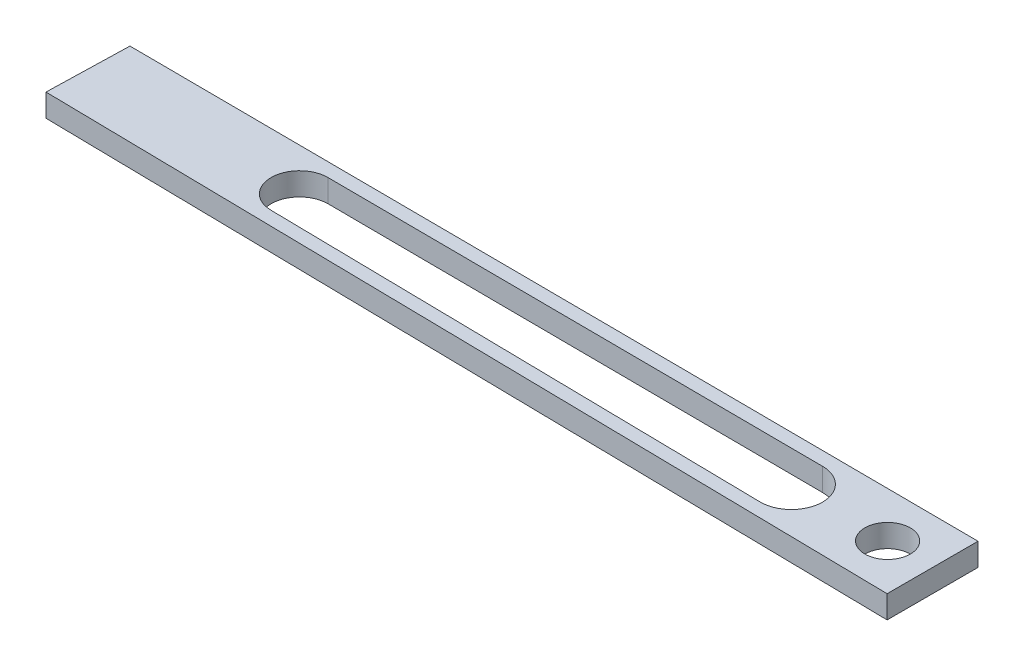
ISO-10303-21;
HEADER;
FILE_DESCRIPTION(('STEP AP214'),'2;1');
FILE_NAME('part.step','',(''),(''),'','','');
FILE_SCHEMA(('AUTOMOTIVE_DESIGN { 1 0 10303 214 1 1 1 1 }'));
ENDSEC;
DATA;
#1=APPLICATION_CONTEXT('core data for automotive mechanical design processes');
#2=APPLICATION_PROTOCOL_DEFINITION('international standard','automotive_design',2000,#1);
#3=PRODUCT_CONTEXT('',#1,'mechanical');
#4=PRODUCT('Part','Part','',(#3));
#5=PRODUCT_RELATED_PRODUCT_CATEGORY('part','',(#4));
#6=PRODUCT_DEFINITION_FORMATION('','',#4);
#7=PRODUCT_DEFINITION_CONTEXT('part definition',#1,'design');
#8=PRODUCT_DEFINITION('design','',#6,#7);
#9=PRODUCT_DEFINITION_SHAPE('','',#8);
#10=(LENGTH_UNIT() NAMED_UNIT(*) SI_UNIT(.MILLI.,.METRE.));
#11=(NAMED_UNIT(*) PLANE_ANGLE_UNIT() SI_UNIT($,.RADIAN.));
#12=(NAMED_UNIT(*) SI_UNIT($,.STERADIAN.) SOLID_ANGLE_UNIT());
#13=UNCERTAINTY_MEASURE_WITH_UNIT(LENGTH_MEASURE(1.E-05),#10,'distance_accuracy_value','');
#14=(GEOMETRIC_REPRESENTATION_CONTEXT(3) GLOBAL_UNCERTAINTY_ASSIGNED_CONTEXT((#13)) GLOBAL_UNIT_ASSIGNED_CONTEXT((#10,
#11,#12)) REPRESENTATION_CONTEXT('',''));
#15=CARTESIAN_POINT('',(0.,0.,0.));
#16=DIRECTION('',(0.,0.,1.));
#17=DIRECTION('',(1.,0.,0.));
#18=AXIS2_PLACEMENT_3D('',#15,#16,#17);
#19=CARTESIAN_POINT('',(0.,0.,0.));
#20=DIRECTION('',(0.,1.,0.));
#21=DIRECTION('',(0.,0.,1.));
#22=AXIS2_PLACEMENT_3D('',#19,#20,#21);
#23=PLANE('',#22);
#24=CARTESIAN_POINT('',(87.6497861096846,0.,53.7974154635264));
#25=DIRECTION('',(0.,1.,0.));
#26=DIRECTION('',(0.,0.,1.));
#27=AXIS2_PLACEMENT_3D('',#24,#25,#26);
#28=CIRCLE('',#27,5.00000000000001);
#29=CARTESIAN_POINT('',(87.6497861096846,0.,58.7974154635264));
#30=VERTEX_POINT('',#29);
#31=EDGE_CURVE('E505',#30,#30,#28,.T.);
#32=ORIENTED_EDGE('',*,*,#31,.T.);
#33=EDGE_LOOP('',(#32));
#34=FACE_BOUND('',#33,.T.);
#35=DIRECTION('',(0.,0.,-1.));
#36=VECTOR('',#35,1.);
#37=CARTESIAN_POINT('',(97.6497861096846,0.,63.9070186237985));
#38=LINE('',#37,#36);
#39=CARTESIAN_POINT('',(97.6497861096846,0.,63.9070186237985));
#40=VERTEX_POINT('',#39);
#41=CARTESIAN_POINT('',(97.6497861096846,0.,43.9070188933852));
#42=VERTEX_POINT('',#41);
#43=EDGE_CURVE('E356',#40,#42,#38,.T.);
#44=ORIENTED_EDGE('',*,*,#43,.F.);
#45=DIRECTION('',(0.999867797982521,0.,0.0162599679454003));
#46=VECTOR('',#45,1.);
#47=CARTESIAN_POINT('',(-90.4748936494814,0.,60.847712914789));
#48=LINE('',#47,#46);
#49=CARTESIAN_POINT('',(-90.4748936494814,0.,60.847712914789));
#50=VERTEX_POINT('',#49);
#51=EDGE_CURVE('E362',#50,#40,#48,.T.);
#52=ORIENTED_EDGE('',*,*,#51,.F.);
#53=DIRECTION('',(-0.0263752128740894,0.,0.999652113560436));
#54=VECTOR('',#53,1.);
#55=CARTESIAN_POINT('',(-89.9999745998487,0.,42.8477129147204));
#56=LINE('',#55,#54);
#57=CARTESIAN_POINT('',(-89.9999745998487,0.,42.8477129147204));
#58=VERTEX_POINT('',#57);
#59=EDGE_CURVE('E378',#58,#50,#56,.T.);
#60=ORIENTED_EDGE('',*,*,#59,.F.);
#61=DIRECTION('',(-0.999984066674016,0.,-0.00564503304662899));
#62=VECTOR('',#61,1.);
#63=CARTESIAN_POINT('',(97.6497861096846,0.,43.9070188933852));
#64=LINE('',#63,#62);
#65=EDGE_CURVE('E375',#42,#58,#64,.T.);
#66=ORIENTED_EDGE('',*,*,#65,.F.);
#67=EDGE_LOOP('',(#44,#52,#60,#66));
#68=FACE_BOUND('',#67,.T.);
#69=CARTESIAN_POINT('',(-87.2369270271719,0.,51.8805994612299));
#70=DIRECTION('',(0.,1.,0.));
#71=DIRECTION('',(0.,0.,1.));
#72=AXIS2_PLACEMENT_3D('',#69,#70,#71);
#73=CIRCLE('',#72,1.5);
#74=CARTESIAN_POINT('',(-87.4316047681078,0.,50.3932862537366));
#75=VERTEX_POINT('',#74);
#76=CARTESIAN_POINT('',(-87.4316047681078,0.,53.3679126687232));
#77=VERTEX_POINT('',#76);
#78=EDGE_CURVE('E191',#75,#77,#73,.T.);
#79=ORIENTED_EDGE('',*,*,#78,.T.);
#80=DIRECTION('',(0.991542138328882,0.,0.129785160623963));
#81=VECTOR('',#80,1.);
#82=CARTESIAN_POINT('',(-87.4316047681078,0.,53.3679126687232));
#83=LINE('',#82,#81);
#84=CARTESIAN_POINT('',(-72.4369270271719,0.,55.3305994612299));
#85=VERTEX_POINT('',#84);
#86=EDGE_CURVE('E276',#77,#85,#83,.T.);
#87=ORIENTED_EDGE('',*,*,#86,.T.);
#88=DIRECTION('',(0.,0.,1.));
#89=VECTOR('',#88,1.);
#90=CARTESIAN_POINT('',(-72.4369270271719,0.,55.3305994612299));
#91=LINE('',#90,#89);
#92=CARTESIAN_POINT('',(-72.4369270271719,0.,58.6305994612299));
#93=VERTEX_POINT('',#92);
#94=EDGE_CURVE('E280',#85,#93,#91,.T.);
#95=ORIENTED_EDGE('',*,*,#94,.T.);
#96=CARTESIAN_POINT('',(-70.5369270271719,0.,58.6305994612299));
#97=DIRECTION('',(0.,1.,0.));
#98=DIRECTION('',(0.,0.,1.));
#99=AXIS2_PLACEMENT_3D('',#96,#97,#98);
#100=CIRCLE('',#99,1.9);
#101=CARTESIAN_POINT('',(-68.6369270271719,0.,58.6305994612299));
#102=VERTEX_POINT('',#101);
#103=EDGE_CURVE('E284',#93,#102,#100,.T.);
#104=ORIENTED_EDGE('',*,*,#103,.T.);
#105=DIRECTION('',(0.,0.,-1.));
#106=VECTOR('',#105,1.);
#107=CARTESIAN_POINT('',(-68.6369270271719,0.,58.6305994612299));
#108=LINE('',#107,#106);
#109=CARTESIAN_POINT('',(-68.6369270271719,0.,54.7805994612299));
#110=VERTEX_POINT('',#109);
#111=EDGE_CURVE('E288',#102,#110,#108,.T.);
#112=ORIENTED_EDGE('',*,*,#111,.T.);
#113=DIRECTION('',(-0.998450950906806,0.,0.0556390028064357));
#114=VECTOR('',#113,1.);
#115=CARTESIAN_POINT('',(-55.641618402645,0.,54.0564316767495));
#116=LINE('',#115,#114);
#117=CARTESIAN_POINT('',(-55.641618402645,0.,54.0564316767495));
#118=VERTEX_POINT('',#117);
#119=EDGE_CURVE('E292',#118,#110,#116,.T.);
#120=ORIENTED_EDGE('',*,*,#119,.F.);
#121=CARTESIAN_POINT('',(-55.8406986191341,0.,52.2247124698447));
#122=DIRECTION('',(0.,1.,0.));
#123=DIRECTION('',(0.,0.,1.));
#124=AXIS2_PLACEMENT_3D('',#121,#122,#123);
#125=CIRCLE('',#124,1.84250595264738);
#126=CARTESIAN_POINT('',(-55.6416184026456,0.,50.3929932629399));
#127=VERTEX_POINT('',#126);
#128=EDGE_CURVE('E296',#118,#127,#125,.T.);
#129=ORIENTED_EDGE('',*,*,#128,.T.);
#130=DIRECTION('',(-0.994145611455372,0.,-0.108048615095357));
#131=VECTOR('',#130,1.);
#132=CARTESIAN_POINT('',(-55.6416184026456,0.,50.3929932629399));
#133=LINE('',#132,#131);
#134=CARTESIAN_POINT('',(-68.6369270271719,0.,48.9805994612299));
#135=VERTEX_POINT('',#134);
#136=EDGE_CURVE('E300',#127,#135,#133,.T.);
#137=ORIENTED_EDGE('',*,*,#136,.T.);
#138=DIRECTION('',(0.,0.,-1.));
#139=VECTOR('',#138,1.);
#140=CARTESIAN_POINT('',(-68.6369270271719,0.,48.9805994612299));
#141=LINE('',#140,#139);
#142=CARTESIAN_POINT('',(-68.6369270271719,0.,45.1305994612299));
#143=VERTEX_POINT('',#142);
#144=EDGE_CURVE('E304',#135,#143,#141,.T.);
#145=ORIENTED_EDGE('',*,*,#144,.T.);
#146=CARTESIAN_POINT('',(-70.5369270271719,0.,45.1305994612299));
#147=DIRECTION('',(0.,1.,0.));
#148=DIRECTION('',(0.,0.,1.));
#149=AXIS2_PLACEMENT_3D('',#146,#147,#148);
#150=CIRCLE('',#149,1.90000000000001);
#151=CARTESIAN_POINT('',(-72.4369270271719,0.,45.1305994612299));
#152=VERTEX_POINT('',#151);
#153=EDGE_CURVE('E308',#143,#152,#150,.T.);
#154=ORIENTED_EDGE('',*,*,#153,.T.);
#155=DIRECTION('',(0.,0.,1.));
#156=VECTOR('',#155,1.);
#157=CARTESIAN_POINT('',(-72.4369270271719,0.,45.1305994612299));
#158=LINE('',#157,#156);
#159=CARTESIAN_POINT('',(-72.4369270271719,0.,48.4305994612299));
#160=VERTEX_POINT('',#159);
#161=EDGE_CURVE('E312',#152,#160,#158,.T.);
#162=ORIENTED_EDGE('',*,*,#161,.T.);
#163=DIRECTION('',(0.991542138328882,0.,-0.129785160623963));
#164=VECTOR('',#163,1.);
#165=CARTESIAN_POINT('',(-87.4316047681078,0.,50.3932862537366));
#166=LINE('',#165,#164);
#167=EDGE_CURVE('E237',#75,#160,#166,.T.);
#168=ORIENTED_EDGE('',*,*,#167,.F.);
#169=EDGE_LOOP('',(#79,#87,#95,#104,#112,#120,#129,#137,#145,#154,#162,#168));
#170=FACE_BOUND('',#169,.T.);
#171=CARTESIAN_POINT('',(66.2645481598678,0.,53.5630262090205));
#172=DIRECTION('',(0.,1.,0.));
#173=DIRECTION('',(0.,0.,1.));
#174=AXIS2_PLACEMENT_3D('',#171,#172,#173);
#175=CIRCLE('',#174,6.83230195508906);
#176=CARTESIAN_POINT('',(66.1534297543832,0.,60.3944245069883));
#177=VERTEX_POINT('',#176);
#178=CARTESIAN_POINT('',(66.303161817034,0.,46.7308333698953));
#179=VERTEX_POINT('',#178);
#180=EDGE_CURVE('E201',#177,#179,#175,.T.);
#181=ORIENTED_EDGE('',*,*,#180,.T.);
#182=DIRECTION('',(0.999984029399674,0.,0.00565163211754443));
#183=VECTOR('',#182,1.);
#184=CARTESIAN_POINT('',(-0.261983475145693,0.,46.3546256485899));
#185=LINE('',#184,#183);
#186=CARTESIAN_POINT('',(-43.135065573272,0.,46.1123188910416));
#187=VERTEX_POINT('',#186);
#188=EDGE_CURVE('E60',#187,#179,#185,.T.);
#189=ORIENTED_EDGE('',*,*,#188,.F.);
#190=CARTESIAN_POINT('',(-43.1703547205744,0.,52.3635836139342));
#191=DIRECTION('',(0.,1.,0.));
#192=DIRECTION('',(0.,0.,1.));
#193=AXIS2_PLACEMENT_3D('',#190,#191,#192);
#194=CIRCLE('',#193,6.25136432785665);
#195=CARTESIAN_POINT('',(-43.2720481743179,0.,58.6141207429387));
#196=VERTEX_POINT('',#195);
#197=EDGE_CURVE('E189',#187,#196,#194,.T.);
#198=ORIENTED_EDGE('',*,*,#197,.T.);
#199=DIRECTION('',(-0.999867677068761,0.,-0.0162674015478994));
#200=VECTOR('',#199,1.);
#201=CARTESIAN_POINT('',(-0.96482427950633,0.,59.3024404228902));
#202=LINE('',#201,#200);
#203=EDGE_CURVE('E218',#177,#196,#202,.T.);
#204=ORIENTED_EDGE('',*,*,#203,.F.);
#205=EDGE_LOOP('',(#181,#189,#198,#204));
#206=FACE_BOUND('',#205,.T.);
#207=ADVANCED_FACE('F44',(#34,#68,#170,#206),#23,.F.);
#208=CARTESIAN_POINT('',(0.,5.,0.));
#209=DIRECTION('',(0.,1.,0.));
#210=DIRECTION('',(0.,0.,1.));
#211=AXIS2_PLACEMENT_3D('',#208,#209,#210);
#212=PLANE('',#211);
#213=CARTESIAN_POINT('',(87.6497861096846,5.,53.7974154635264));
#214=DIRECTION('',(0.,1.,0.));
#215=DIRECTION('',(0.,0.,1.));
#216=AXIS2_PLACEMENT_3D('',#213,#214,#215);
#217=CIRCLE('',#216,5.00000000000001);
#218=CARTESIAN_POINT('',(87.6497861096846,5.,58.7974154635264));
#219=VERTEX_POINT('',#218);
#220=EDGE_CURVE('E215',#219,#219,#217,.T.);
#221=ORIENTED_EDGE('',*,*,#220,.F.);
#222=EDGE_LOOP('',(#221));
#223=FACE_BOUND('',#222,.T.);
#224=DIRECTION('',(0.,0.,-1.));
#225=VECTOR('',#224,1.);
#226=CARTESIAN_POINT('',(97.6497861096846,5.,63.9070186237985));
#227=LINE('',#226,#225);
#228=CARTESIAN_POINT('',(97.6497861096846,5.,63.9070186237985));
#229=VERTEX_POINT('',#228);
#230=CARTESIAN_POINT('',(97.6497861096846,5.,43.9070188933852));
#231=VERTEX_POINT('',#230);
#232=EDGE_CURVE('E357',#229,#231,#227,.T.);
#233=ORIENTED_EDGE('',*,*,#232,.T.);
#234=DIRECTION('',(-0.999984066674016,0.,-0.00564503304662899));
#235=VECTOR('',#234,1.);
#236=CARTESIAN_POINT('',(97.6497861096846,5.,43.9070188933852));
#237=LINE('',#236,#235);
#238=CARTESIAN_POINT('',(-89.9999745998487,5.,42.8477129147204));
#239=VERTEX_POINT('',#238);
#240=EDGE_CURVE('E361',#231,#239,#237,.T.);
#241=ORIENTED_EDGE('',*,*,#240,.T.);
#242=DIRECTION('',(-0.0263752128740894,0.,0.999652113560436));
#243=VECTOR('',#242,1.);
#244=CARTESIAN_POINT('',(-89.9999745998487,5.,42.8477129147204));
#245=LINE('',#244,#243);
#246=CARTESIAN_POINT('',(-90.4748936494814,5.,60.847712914789));
#247=VERTEX_POINT('',#246);
#248=EDGE_CURVE('E365',#239,#247,#245,.T.);
#249=ORIENTED_EDGE('',*,*,#248,.T.);
#250=DIRECTION('',(0.999867797982521,0.,0.0162599679454003));
#251=VECTOR('',#250,1.);
#252=CARTESIAN_POINT('',(-90.4748936494814,5.,60.847712914789));
#253=LINE('',#252,#251);
#254=EDGE_CURVE('E368',#247,#229,#253,.T.);
#255=ORIENTED_EDGE('',*,*,#254,.T.);
#256=EDGE_LOOP('',(#233,#241,#249,#255));
#257=FACE_BOUND('',#256,.T.);
#258=DIRECTION('',(0.999984029399674,0.,0.00565163211754443));
#259=VECTOR('',#258,1.);
#260=CARTESIAN_POINT('',(-0.261983475145693,5.,46.3546256485899));
#261=LINE('',#260,#259);
#262=CARTESIAN_POINT('',(-43.135065573272,5.,46.1123188910416));
#263=VERTEX_POINT('',#262);
#264=CARTESIAN_POINT('',(66.303161817034,5.,46.7308333698953));
#265=VERTEX_POINT('',#264);
#266=EDGE_CURVE('E195',#263,#265,#261,.T.);
#267=ORIENTED_EDGE('',*,*,#266,.T.);
#268=CARTESIAN_POINT('',(66.2645481598678,5.,53.5630262090205));
#269=DIRECTION('',(0.,1.,0.));
#270=DIRECTION('',(0.,0.,1.));
#271=AXIS2_PLACEMENT_3D('',#268,#269,#270);
#272=CIRCLE('',#271,6.83230195508906);
#273=CARTESIAN_POINT('',(66.1534297543832,5.,60.3944245069883));
#274=VERTEX_POINT('',#273);
#275=EDGE_CURVE('E207',#274,#265,#272,.T.);
#276=ORIENTED_EDGE('',*,*,#275,.F.);
#277=DIRECTION('',(-0.999867677068761,0.,-0.0162674015478994));
#278=VECTOR('',#277,1.);
#279=CARTESIAN_POINT('',(-0.96482427950633,5.,59.3024404228902));
#280=LINE('',#279,#278);
#281=CARTESIAN_POINT('',(-43.2720481743179,5.,58.6141207429387));
#282=VERTEX_POINT('',#281);
#283=EDGE_CURVE('E68',#274,#282,#280,.T.);
#284=ORIENTED_EDGE('',*,*,#283,.T.);
#285=CARTESIAN_POINT('',(-43.1703547205744,5.,52.3635836139342));
#286=DIRECTION('',(0.,1.,0.));
#287=DIRECTION('',(0.,0.,1.));
#288=AXIS2_PLACEMENT_3D('',#285,#286,#287);
#289=CIRCLE('',#288,6.25136432785665);
#290=EDGE_CURVE('E187',#263,#282,#289,.T.);
#291=ORIENTED_EDGE('',*,*,#290,.F.);
#292=EDGE_LOOP('',(#267,#276,#284,#291));
#293=FACE_BOUND('',#292,.T.);
#294=ADVANCED_FACE('F203',(#223,#257,#293),#212,.T.);
#295=CARTESIAN_POINT('',(97.6497861096846,5.,63.9070186237985));
#296=DIRECTION('',(-1.,0.,0.));
#297=DIRECTION('',(0.,0.,1.));
#298=AXIS2_PLACEMENT_3D('',#295,#296,#297);
#299=PLANE('',#298);
#300=ORIENTED_EDGE('',*,*,#43,.T.);
#301=DIRECTION('',(0.,-1.,0.));
#302=VECTOR('',#301,1.);
#303=CARTESIAN_POINT('',(97.6497861096846,5.,43.9070188933852));
#304=LINE('',#303,#302);
#305=EDGE_CURVE('E12',#231,#42,#304,.T.);
#306=ORIENTED_EDGE('',*,*,#305,.F.);
#307=ORIENTED_EDGE('',*,*,#232,.F.);
#308=DIRECTION('',(0.,-1.,0.));
#309=VECTOR('',#308,1.);
#310=CARTESIAN_POINT('',(97.6497861096846,5.,63.9070186237985));
#311=LINE('',#310,#309);
#312=EDGE_CURVE('E371',#229,#40,#311,.T.);
#313=ORIENTED_EDGE('',*,*,#312,.T.);
#314=EDGE_LOOP('',(#300,#306,#307,#313));
#315=FACE_BOUND('',#314,.T.);
#316=ADVANCED_FACE('F46',(#315),#299,.F.);
#317=CARTESIAN_POINT('',(97.6497861096846,5.,43.9070188933852));
#318=DIRECTION('',(-0.00564503304662899,0.,0.999984066674016));
#319=DIRECTION('',(0.999984066674016,0.,0.00564503304662899));
#320=AXIS2_PLACEMENT_3D('',#317,#318,#319);
#321=PLANE('',#320);
#322=ORIENTED_EDGE('',*,*,#65,.T.);
#323=DIRECTION('',(0.,-1.,0.));
#324=VECTOR('',#323,1.);
#325=CARTESIAN_POINT('',(-89.9999745998487,5.,42.8477129147204));
#326=LINE('',#325,#324);
#327=EDGE_CURVE('E53',#239,#58,#326,.T.);
#328=ORIENTED_EDGE('',*,*,#327,.F.);
#329=ORIENTED_EDGE('',*,*,#240,.F.);
#330=ORIENTED_EDGE('',*,*,#305,.T.);
#331=EDGE_LOOP('',(#322,#328,#329,#330));
#332=FACE_BOUND('',#331,.T.);
#333=ADVANCED_FACE('F410',(#332),#321,.F.);
#334=CARTESIAN_POINT('',(-89.9999745998487,5.,42.8477129147204));
#335=DIRECTION('',(0.999652113560436,0.,0.0263752128740894));
#336=DIRECTION('',(0.0263752128740894,0.,-0.999652113560436));
#337=AXIS2_PLACEMENT_3D('',#334,#335,#336);
#338=PLANE('',#337);
#339=ORIENTED_EDGE('',*,*,#59,.T.);
#340=DIRECTION('',(0.,-1.,0.));
#341=VECTOR('',#340,1.);
#342=CARTESIAN_POINT('',(-90.4748936494814,5.,60.847712914789));
#343=LINE('',#342,#341);
#344=EDGE_CURVE('E386',#247,#50,#343,.T.);
#345=ORIENTED_EDGE('',*,*,#344,.F.);
#346=ORIENTED_EDGE('',*,*,#248,.F.);
#347=ORIENTED_EDGE('',*,*,#327,.T.);
#348=EDGE_LOOP('',(#339,#345,#346,#347));
#349=FACE_BOUND('',#348,.T.);
#350=ADVANCED_FACE('F395',(#349),#338,.F.);
#351=CARTESIAN_POINT('',(-90.4748936494814,5.,60.847712914789));
#352=DIRECTION('',(0.0162599679454003,0.,-0.999867797982521));
#353=DIRECTION('',(-0.999867797982521,0.,-0.0162599679454003));
#354=AXIS2_PLACEMENT_3D('',#351,#352,#353);
#355=PLANE('',#354);
#356=ORIENTED_EDGE('',*,*,#51,.T.);
#357=ORIENTED_EDGE('',*,*,#312,.F.);
#358=ORIENTED_EDGE('',*,*,#254,.F.);
#359=ORIENTED_EDGE('',*,*,#344,.T.);
#360=EDGE_LOOP('',(#356,#357,#358,#359));
#361=FACE_BOUND('',#360,.T.);
#362=ADVANCED_FACE('F404',(#361),#355,.F.);
#363=CARTESIAN_POINT('',(-87.2369270271719,1.5,51.8805994612299));
#364=DIRECTION('',(0.,-1.,0.));
#365=DIRECTION('',(0.,0.,-1.));
#366=AXIS2_PLACEMENT_3D('',#363,#364,#365);
#367=CYLINDRICAL_SURFACE('',#366,1.5);
#368=ORIENTED_EDGE('',*,*,#78,.F.);
#369=DIRECTION('',(0.,-1.,0.));
#370=VECTOR('',#369,1.);
#371=CARTESIAN_POINT('',(-87.4316047681078,1.5,50.3932862537366));
#372=LINE('',#371,#370);
#373=CARTESIAN_POINT('',(-87.4316047681078,1.5,50.3932862537366));
#374=VERTEX_POINT('',#373);
#375=EDGE_CURVE('E272',#374,#75,#372,.T.);
#376=ORIENTED_EDGE('',*,*,#375,.F.);
#377=CARTESIAN_POINT('',(-87.2369270271719,1.5,51.8805994612299));
#378=DIRECTION('',(0.,1.,0.));
#379=DIRECTION('',(0.,0.,1.));
#380=AXIS2_PLACEMENT_3D('',#377,#378,#379);
#381=CIRCLE('',#380,1.5);
#382=CARTESIAN_POINT('',(-87.4316047681078,1.5,53.3679126687232));
#383=VERTEX_POINT('',#382);
#384=EDGE_CURVE('E232',#374,#383,#381,.T.);
#385=ORIENTED_EDGE('',*,*,#384,.T.);
#386=DIRECTION('',(0.,-1.,0.));
#387=VECTOR('',#386,1.);
#388=CARTESIAN_POINT('',(-87.4316047681078,1.5,53.3679126687232));
#389=LINE('',#388,#387);
#390=EDGE_CURVE('E352',#383,#77,#389,.T.);
#391=ORIENTED_EDGE('',*,*,#390,.T.);
#392=EDGE_LOOP('',(#368,#376,#385,#391));
#393=FACE_BOUND('',#392,.T.);
#394=ADVANCED_FACE('F429',(#393),#367,.F.);
#395=CARTESIAN_POINT('',(-87.4316047681078,1.5,53.3679126687232));
#396=DIRECTION('',(0.129785160623963,0.,-0.991542138328882));
#397=DIRECTION('',(-0.991542138328882,0.,-0.129785160623963));
#398=AXIS2_PLACEMENT_3D('',#395,#396,#397);
#399=PLANE('',#398);
#400=ORIENTED_EDGE('',*,*,#86,.F.);
#401=ORIENTED_EDGE('',*,*,#390,.F.);
#402=DIRECTION('',(0.991542138328882,0.,0.129785160623963));
#403=VECTOR('',#402,1.);
#404=CARTESIAN_POINT('',(-87.4316047681078,1.5,53.3679126687232));
#405=LINE('',#404,#403);
#406=CARTESIAN_POINT('',(-72.4369270271719,1.5,55.3305994612299));
#407=VERTEX_POINT('',#406);
#408=EDGE_CURVE('E236',#383,#407,#405,.T.);
#409=ORIENTED_EDGE('',*,*,#408,.T.);
#410=DIRECTION('',(0.,-1.,0.));
#411=VECTOR('',#410,1.);
#412=CARTESIAN_POINT('',(-72.4369270271719,1.5,55.3305994612299));
#413=LINE('',#412,#411);
#414=EDGE_CURVE('E349',#407,#85,#413,.T.);
#415=ORIENTED_EDGE('',*,*,#414,.T.);
#416=EDGE_LOOP('',(#400,#401,#409,#415));
#417=FACE_BOUND('',#416,.T.);
#418=ADVANCED_FACE('F433',(#417),#399,.T.);
#419=CARTESIAN_POINT('',(-72.4369270271719,1.5,55.3305994612299));
#420=DIRECTION('',(1.,0.,0.));
#421=DIRECTION('',(0.,0.,-1.));
#422=AXIS2_PLACEMENT_3D('',#419,#420,#421);
#423=PLANE('',#422);
#424=ORIENTED_EDGE('',*,*,#94,.F.);
#425=ORIENTED_EDGE('',*,*,#414,.F.);
#426=DIRECTION('',(0.,0.,1.));
#427=VECTOR('',#426,1.);
#428=CARTESIAN_POINT('',(-72.4369270271719,1.5,55.3305994612299));
#429=LINE('',#428,#427);
#430=CARTESIAN_POINT('',(-72.4369270271719,1.5,58.6305994612299));
#431=VERTEX_POINT('',#430);
#432=EDGE_CURVE('E240',#407,#431,#429,.T.);
#433=ORIENTED_EDGE('',*,*,#432,.T.);
#434=DIRECTION('',(0.,-1.,0.));
#435=VECTOR('',#434,1.);
#436=CARTESIAN_POINT('',(-72.4369270271719,1.5,58.6305994612299));
#437=LINE('',#436,#435);
#438=EDGE_CURVE('E346',#431,#93,#437,.T.);
#439=ORIENTED_EDGE('',*,*,#438,.T.);
#440=EDGE_LOOP('',(#424,#425,#433,#439));
#441=FACE_BOUND('',#440,.T.);
#442=ADVANCED_FACE('F438',(#441),#423,.T.);
#443=CARTESIAN_POINT('',(-70.5369270271719,1.5,58.6305994612299));
#444=DIRECTION('',(0.,-1.,0.));
#445=DIRECTION('',(0.,0.,-1.));
#446=AXIS2_PLACEMENT_3D('',#443,#444,#445);
#447=CYLINDRICAL_SURFACE('',#446,1.9);
#448=ORIENTED_EDGE('',*,*,#103,.F.);
#449=ORIENTED_EDGE('',*,*,#438,.F.);
#450=CARTESIAN_POINT('',(-70.5369270271719,1.5,58.6305994612299));
#451=DIRECTION('',(0.,1.,0.));
#452=DIRECTION('',(0.,0.,1.));
#453=AXIS2_PLACEMENT_3D('',#450,#451,#452);
#454=CIRCLE('',#453,1.9);
#455=CARTESIAN_POINT('',(-68.6369270271719,1.5,58.6305994612299));
#456=VERTEX_POINT('',#455);
#457=EDGE_CURVE('E243',#431,#456,#454,.T.);
#458=ORIENTED_EDGE('',*,*,#457,.T.);
#459=DIRECTION('',(0.,-1.,0.));
#460=VECTOR('',#459,1.);
#461=CARTESIAN_POINT('',(-68.6369270271719,1.5,58.6305994612299));
#462=LINE('',#461,#460);
#463=EDGE_CURVE('E343',#456,#102,#462,.T.);
#464=ORIENTED_EDGE('',*,*,#463,.T.);
#465=EDGE_LOOP('',(#448,#449,#458,#464));
#466=FACE_BOUND('',#465,.T.);
#467=ADVANCED_FACE('F444',(#466),#447,.F.);
#468=CARTESIAN_POINT('',(-68.6369270271719,1.5,58.6305994612299));
#469=DIRECTION('',(-1.,0.,0.));
#470=DIRECTION('',(0.,0.,1.));
#471=AXIS2_PLACEMENT_3D('',#468,#469,#470);
#472=PLANE('',#471);
#473=ORIENTED_EDGE('',*,*,#111,.F.);
#474=ORIENTED_EDGE('',*,*,#463,.F.);
#475=DIRECTION('',(0.,0.,-1.));
#476=VECTOR('',#475,1.);
#477=CARTESIAN_POINT('',(-68.6369270271719,1.5,58.6305994612299));
#478=LINE('',#477,#476);
#479=CARTESIAN_POINT('',(-68.6369270271719,1.5,54.7805994612299));
#480=VERTEX_POINT('',#479);
#481=EDGE_CURVE('E246',#456,#480,#478,.T.);
#482=ORIENTED_EDGE('',*,*,#481,.T.);
#483=DIRECTION('',(0.,-1.,0.));
#484=VECTOR('',#483,1.);
#485=CARTESIAN_POINT('',(-68.6369270271719,1.5,54.7805994612299));
#486=LINE('',#485,#484);
#487=EDGE_CURVE('E340',#480,#110,#486,.T.);
#488=ORIENTED_EDGE('',*,*,#487,.T.);
#489=EDGE_LOOP('',(#473,#474,#482,#488));
#490=FACE_BOUND('',#489,.T.);
#491=ADVANCED_FACE('F448',(#490),#472,.T.);
#492=CARTESIAN_POINT('',(-55.641618402645,1.5,54.0564316767495));
#493=DIRECTION('',(0.0556390028064357,0.,0.998450950906806));
#494=DIRECTION('',(0.998450950906806,0.,-0.0556390028064357));
#495=AXIS2_PLACEMENT_3D('',#492,#493,#494);
#496=PLANE('',#495);
#497=ORIENTED_EDGE('',*,*,#119,.T.);
#498=ORIENTED_EDGE('',*,*,#487,.F.);
#499=DIRECTION('',(-0.998450950906806,0.,0.0556390028064357));
#500=VECTOR('',#499,1.);
#501=CARTESIAN_POINT('',(-55.641618402645,1.5,54.0564316767495));
#502=LINE('',#501,#500);
#503=CARTESIAN_POINT('',(-55.641618402645,1.5,54.0564316767495));
#504=VERTEX_POINT('',#503);
#505=EDGE_CURVE('E249',#504,#480,#502,.T.);
#506=ORIENTED_EDGE('',*,*,#505,.F.);
#507=DIRECTION('',(0.,-1.,0.));
#508=VECTOR('',#507,1.);
#509=CARTESIAN_POINT('',(-55.641618402645,1.5,54.0564316767495));
#510=LINE('',#509,#508);
#511=EDGE_CURVE('E337',#504,#118,#510,.T.);
#512=ORIENTED_EDGE('',*,*,#511,.T.);
#513=EDGE_LOOP('',(#497,#498,#506,#512));
#514=FACE_BOUND('',#513,.T.);
#515=ADVANCED_FACE('F452',(#514),#496,.F.);
#516=CARTESIAN_POINT('',(-55.8406986191341,1.5,52.2247124698447));
#517=DIRECTION('',(0.,-1.,0.));
#518=DIRECTION('',(0.,0.,-1.));
#519=AXIS2_PLACEMENT_3D('',#516,#517,#518);
#520=CYLINDRICAL_SURFACE('',#519,1.84250595264738);
#521=ORIENTED_EDGE('',*,*,#128,.F.);
#522=ORIENTED_EDGE('',*,*,#511,.F.);
#523=CARTESIAN_POINT('',(-55.8406986191341,1.5,52.2247124698447));
#524=DIRECTION('',(0.,1.,0.));
#525=DIRECTION('',(0.,0.,1.));
#526=AXIS2_PLACEMENT_3D('',#523,#524,#525);
#527=CIRCLE('',#526,1.84250595264738);
#528=CARTESIAN_POINT('',(-55.6416184026456,1.5,50.3929932629399));
#529=VERTEX_POINT('',#528);
#530=EDGE_CURVE('E253',#504,#529,#527,.T.);
#531=ORIENTED_EDGE('',*,*,#530,.T.);
#532=DIRECTION('',(0.,-1.,0.));
#533=VECTOR('',#532,1.);
#534=CARTESIAN_POINT('',(-55.6416184026456,1.5,50.3929932629399));
#535=LINE('',#534,#533);
#536=EDGE_CURVE('E334',#529,#127,#535,.T.);
#537=ORIENTED_EDGE('',*,*,#536,.T.);
#538=EDGE_LOOP('',(#521,#522,#531,#537));
#539=FACE_BOUND('',#538,.T.);
#540=ADVANCED_FACE('F456',(#539),#520,.F.);
#541=CARTESIAN_POINT('',(-55.6416184026456,1.5,50.3929932629399));
#542=DIRECTION('',(-0.108048615095357,0.,0.994145611455372));
#543=DIRECTION('',(0.994145611455372,0.,0.108048615095357));
#544=AXIS2_PLACEMENT_3D('',#541,#542,#543);
#545=PLANE('',#544);
#546=ORIENTED_EDGE('',*,*,#136,.F.);
#547=ORIENTED_EDGE('',*,*,#536,.F.);
#548=DIRECTION('',(-0.994145611455372,0.,-0.108048615095357));
#549=VECTOR('',#548,1.);
#550=CARTESIAN_POINT('',(-55.6416184026456,1.5,50.3929932629399));
#551=LINE('',#550,#549);
#552=CARTESIAN_POINT('',(-68.6369270271719,1.5,48.9805994612299));
#553=VERTEX_POINT('',#552);
#554=EDGE_CURVE('E256',#529,#553,#551,.T.);
#555=ORIENTED_EDGE('',*,*,#554,.T.);
#556=DIRECTION('',(0.,-1.,0.));
#557=VECTOR('',#556,1.);
#558=CARTESIAN_POINT('',(-68.6369270271719,1.5,48.9805994612299));
#559=LINE('',#558,#557);
#560=EDGE_CURVE('E331',#553,#135,#559,.T.);
#561=ORIENTED_EDGE('',*,*,#560,.T.);
#562=EDGE_LOOP('',(#546,#547,#555,#561));
#563=FACE_BOUND('',#562,.T.);
#564=ADVANCED_FACE('F460',(#563),#545,.T.);
#565=CARTESIAN_POINT('',(-68.6369270271719,1.5,48.9805994612299));
#566=DIRECTION('',(-1.,0.,0.));
#567=DIRECTION('',(0.,0.,1.));
#568=AXIS2_PLACEMENT_3D('',#565,#566,#567);
#569=PLANE('',#568);
#570=ORIENTED_EDGE('',*,*,#144,.F.);
#571=ORIENTED_EDGE('',*,*,#560,.F.);
#572=DIRECTION('',(0.,0.,-1.));
#573=VECTOR('',#572,1.);
#574=CARTESIAN_POINT('',(-68.6369270271719,1.5,48.9805994612299));
#575=LINE('',#574,#573);
#576=CARTESIAN_POINT('',(-68.6369270271719,1.5,45.1305994612299));
#577=VERTEX_POINT('',#576);
#578=EDGE_CURVE('E259',#553,#577,#575,.T.);
#579=ORIENTED_EDGE('',*,*,#578,.T.);
#580=DIRECTION('',(0.,-1.,0.));
#581=VECTOR('',#580,1.);
#582=CARTESIAN_POINT('',(-68.6369270271719,1.5,45.1305994612299));
#583=LINE('',#582,#581);
#584=EDGE_CURVE('E328',#577,#143,#583,.T.);
#585=ORIENTED_EDGE('',*,*,#584,.T.);
#586=EDGE_LOOP('',(#570,#571,#579,#585));
#587=FACE_BOUND('',#586,.T.);
#588=ADVANCED_FACE('F464',(#587),#569,.T.);
#589=CARTESIAN_POINT('',(-70.5369270271719,1.5,45.1305994612299));
#590=DIRECTION('',(0.,-1.,0.));
#591=DIRECTION('',(0.,0.,-1.));
#592=AXIS2_PLACEMENT_3D('',#589,#590,#591);
#593=CYLINDRICAL_SURFACE('',#592,1.90000000000001);
#594=ORIENTED_EDGE('',*,*,#153,.F.);
#595=ORIENTED_EDGE('',*,*,#584,.F.);
#596=CARTESIAN_POINT('',(-70.5369270271719,1.5,45.1305994612299));
#597=DIRECTION('',(0.,1.,0.));
#598=DIRECTION('',(0.,0.,1.));
#599=AXIS2_PLACEMENT_3D('',#596,#597,#598);
#600=CIRCLE('',#599,1.90000000000001);
#601=CARTESIAN_POINT('',(-72.4369270271719,1.5,45.1305994612299));
#602=VERTEX_POINT('',#601);
#603=EDGE_CURVE('E262',#577,#602,#600,.T.);
#604=ORIENTED_EDGE('',*,*,#603,.T.);
#605=DIRECTION('',(0.,-1.,0.));
#606=VECTOR('',#605,1.);
#607=CARTESIAN_POINT('',(-72.4369270271719,1.5,45.1305994612299));
#608=LINE('',#607,#606);
#609=EDGE_CURVE('E325',#602,#152,#608,.T.);
#610=ORIENTED_EDGE('',*,*,#609,.T.);
#611=EDGE_LOOP('',(#594,#595,#604,#610));
#612=FACE_BOUND('',#611,.T.);
#613=ADVANCED_FACE('F468',(#612),#593,.F.);
#614=CARTESIAN_POINT('',(-72.4369270271719,1.5,45.1305994612299));
#615=DIRECTION('',(1.,0.,0.));
#616=DIRECTION('',(0.,0.,-1.));
#617=AXIS2_PLACEMENT_3D('',#614,#615,#616);
#618=PLANE('',#617);
#619=ORIENTED_EDGE('',*,*,#161,.F.);
#620=ORIENTED_EDGE('',*,*,#609,.F.);
#621=DIRECTION('',(0.,0.,1.));
#622=VECTOR('',#621,1.);
#623=CARTESIAN_POINT('',(-72.4369270271719,1.5,45.1305994612299));
#624=LINE('',#623,#622);
#625=CARTESIAN_POINT('',(-72.4369270271719,1.5,48.4305994612299));
#626=VERTEX_POINT('',#625);
#627=EDGE_CURVE('E265',#602,#626,#624,.T.);
#628=ORIENTED_EDGE('',*,*,#627,.T.);
#629=DIRECTION('',(0.,-1.,0.));
#630=VECTOR('',#629,1.);
#631=CARTESIAN_POINT('',(-72.4369270271719,1.5,48.4305994612299));
#632=LINE('',#631,#630);
#633=EDGE_CURVE('E322',#626,#160,#632,.T.);
#634=ORIENTED_EDGE('',*,*,#633,.T.);
#635=EDGE_LOOP('',(#619,#620,#628,#634));
#636=FACE_BOUND('',#635,.T.);
#637=ADVANCED_FACE('F472',(#636),#618,.T.);
#638=CARTESIAN_POINT('',(-87.4316047681078,1.5,50.3932862537366));
#639=DIRECTION('',(-0.129785160623963,0.,-0.991542138328882));
#640=DIRECTION('',(-0.991542138328882,0.,0.129785160623963));
#641=AXIS2_PLACEMENT_3D('',#638,#639,#640);
#642=PLANE('',#641);
#643=ORIENTED_EDGE('',*,*,#167,.T.);
#644=ORIENTED_EDGE('',*,*,#633,.F.);
#645=DIRECTION('',(0.991542138328882,0.,-0.129785160623963));
#646=VECTOR('',#645,1.);
#647=CARTESIAN_POINT('',(-87.4316047681078,1.5,50.3932862537366));
#648=LINE('',#647,#646);
#649=EDGE_CURVE('E268',#374,#626,#648,.T.);
#650=ORIENTED_EDGE('',*,*,#649,.F.);
#651=ORIENTED_EDGE('',*,*,#375,.T.);
#652=EDGE_LOOP('',(#643,#644,#650,#651));
#653=FACE_BOUND('',#652,.T.);
#654=ADVANCED_FACE('F476',(#653),#642,.F.);
#655=CARTESIAN_POINT('',(-87.2369270271719,1.5,51.8805994612299));
#656=DIRECTION('',(0.,1.,0.));
#657=DIRECTION('',(0.,0.,1.));
#658=AXIS2_PLACEMENT_3D('',#655,#656,#657);
#659=PLANE('',#658);
#660=ORIENTED_EDGE('',*,*,#384,.F.);
#661=ORIENTED_EDGE('',*,*,#649,.T.);
#662=ORIENTED_EDGE('',*,*,#627,.F.);
#663=ORIENTED_EDGE('',*,*,#603,.F.);
#664=ORIENTED_EDGE('',*,*,#578,.F.);
#665=ORIENTED_EDGE('',*,*,#554,.F.);
#666=ORIENTED_EDGE('',*,*,#530,.F.);
#667=ORIENTED_EDGE('',*,*,#505,.T.);
#668=ORIENTED_EDGE('',*,*,#481,.F.);
#669=ORIENTED_EDGE('',*,*,#457,.F.);
#670=ORIENTED_EDGE('',*,*,#432,.F.);
#671=ORIENTED_EDGE('',*,*,#408,.F.);
#672=EDGE_LOOP('',(#660,#661,#662,#663,#664,#665,#666,#667,#668,#669,#670,#671));
#673=FACE_BOUND('',#672,.T.);
#674=ADVANCED_FACE('F480',(#673),#659,.F.);
#675=CARTESIAN_POINT('',(-0.261983475145693,5.,46.3546256485899));
#676=DIRECTION('',(0.00565163211754443,0.,-0.999984029399674));
#677=DIRECTION('',(-0.999984029399674,0.,-0.00565163211754443));
#678=AXIS2_PLACEMENT_3D('',#675,#676,#677);
#679=PLANE('',#678);
#680=ORIENTED_EDGE('',*,*,#188,.T.);
#681=DIRECTION('',(0.,-1.,0.));
#682=VECTOR('',#681,1.);
#683=CARTESIAN_POINT('',(66.303161817034,5.,46.7308333698953));
#684=LINE('',#683,#682);
#685=EDGE_CURVE('E197',#265,#179,#684,.T.);
#686=ORIENTED_EDGE('',*,*,#685,.F.);
#687=ORIENTED_EDGE('',*,*,#266,.F.);
#688=DIRECTION('',(0.,-1.,0.));
#689=VECTOR('',#688,1.);
#690=CARTESIAN_POINT('',(-43.135065573272,5.,46.1123188910416));
#691=LINE('',#690,#689);
#692=EDGE_CURVE('E183',#263,#187,#691,.T.);
#693=ORIENTED_EDGE('',*,*,#692,.T.);
#694=EDGE_LOOP('',(#680,#686,#687,#693));
#695=FACE_BOUND('',#694,.T.);
#696=ADVANCED_FACE('F196',(#695),#679,.F.);
#697=CARTESIAN_POINT('',(-43.1703547205744,5.,52.3635836139342));
#698=DIRECTION('',(0.,-1.,0.));
#699=DIRECTION('',(0.,0.,-1.));
#700=AXIS2_PLACEMENT_3D('',#697,#698,#699);
#701=CYLINDRICAL_SURFACE('',#700,6.25136432785665);
#702=ORIENTED_EDGE('',*,*,#197,.F.);
#703=ORIENTED_EDGE('',*,*,#692,.F.);
#704=ORIENTED_EDGE('',*,*,#290,.T.);
#705=DIRECTION('',(0.,-1.,0.));
#706=VECTOR('',#705,1.);
#707=CARTESIAN_POINT('',(-43.2720481743179,5.,58.6141207429387));
#708=LINE('',#707,#706);
#709=EDGE_CURVE('E192',#282,#196,#708,.T.);
#710=ORIENTED_EDGE('',*,*,#709,.T.);
#711=EDGE_LOOP('',(#702,#703,#704,#710));
#712=FACE_BOUND('',#711,.T.);
#713=ADVANCED_FACE('F185',(#712),#701,.F.);
#714=CARTESIAN_POINT('',(-0.96482427950633,5.,59.3024404228902));
#715=DIRECTION('',(-0.0162674015478994,0.,0.999867677068761));
#716=DIRECTION('',(0.999867677068761,0.,0.0162674015478994));
#717=AXIS2_PLACEMENT_3D('',#714,#715,#716);
#718=PLANE('',#717);
#719=ORIENTED_EDGE('',*,*,#203,.T.);
#720=ORIENTED_EDGE('',*,*,#709,.F.);
#721=ORIENTED_EDGE('',*,*,#283,.F.);
#722=DIRECTION('',(0.,-1.,0.));
#723=VECTOR('',#722,1.);
#724=CARTESIAN_POINT('',(66.1534297543832,5.,60.3944245069883));
#725=LINE('',#724,#723);
#726=EDGE_CURVE('E227',#274,#177,#725,.T.);
#727=ORIENTED_EDGE('',*,*,#726,.T.);
#728=EDGE_LOOP('',(#719,#720,#721,#727));
#729=FACE_BOUND('',#728,.T.);
#730=ADVANCED_FACE('F489',(#729),#718,.F.);
#731=CARTESIAN_POINT('',(66.2645481598678,5.,53.5630262090205));
#732=DIRECTION('',(0.,-1.,0.));
#733=DIRECTION('',(0.,0.,-1.));
#734=AXIS2_PLACEMENT_3D('',#731,#732,#733);
#735=CYLINDRICAL_SURFACE('',#734,6.83230195508906);
#736=ORIENTED_EDGE('',*,*,#180,.F.);
#737=ORIENTED_EDGE('',*,*,#726,.F.);
#738=ORIENTED_EDGE('',*,*,#275,.T.);
#739=ORIENTED_EDGE('',*,*,#685,.T.);
#740=EDGE_LOOP('',(#736,#737,#738,#739));
#741=FACE_BOUND('',#740,.T.);
#742=ADVANCED_FACE('F492',(#741),#735,.F.);
#743=CARTESIAN_POINT('',(87.6497861096846,5.,53.7974154635264));
#744=DIRECTION('',(0.,-1.,0.));
#745=DIRECTION('',(0.,0.,-1.));
#746=AXIS2_PLACEMENT_3D('',#743,#744,#745);
#747=CYLINDRICAL_SURFACE('',#746,5.00000000000001);
#748=ORIENTED_EDGE('',*,*,#220,.T.);
#749=EDGE_LOOP('',(#748));
#750=FACE_BOUND('',#749,.T.);
#751=ORIENTED_EDGE('',*,*,#31,.F.);
#752=EDGE_LOOP('',(#751));
#753=FACE_BOUND('',#752,.T.);
#754=ADVANCED_FACE('F495',(#750,#753),#747,.F.);
#755=CLOSED_SHELL('',(#207,#294,#316,#333,#350,#362,#394,#418,#442,#467,#491,#515,#540,#564,
#588,#613,#637,#654,#674,#696,#713,#730,#742,#754));
#756=MANIFOLD_SOLID_BREP('B2',#755);
#757=ADVANCED_BREP_SHAPE_REPRESENTATION('',(#18,#756),#14);
#758=SHAPE_DEFINITION_REPRESENTATION(#9,#757);
ENDSEC;
END-ISO-10303-21;
